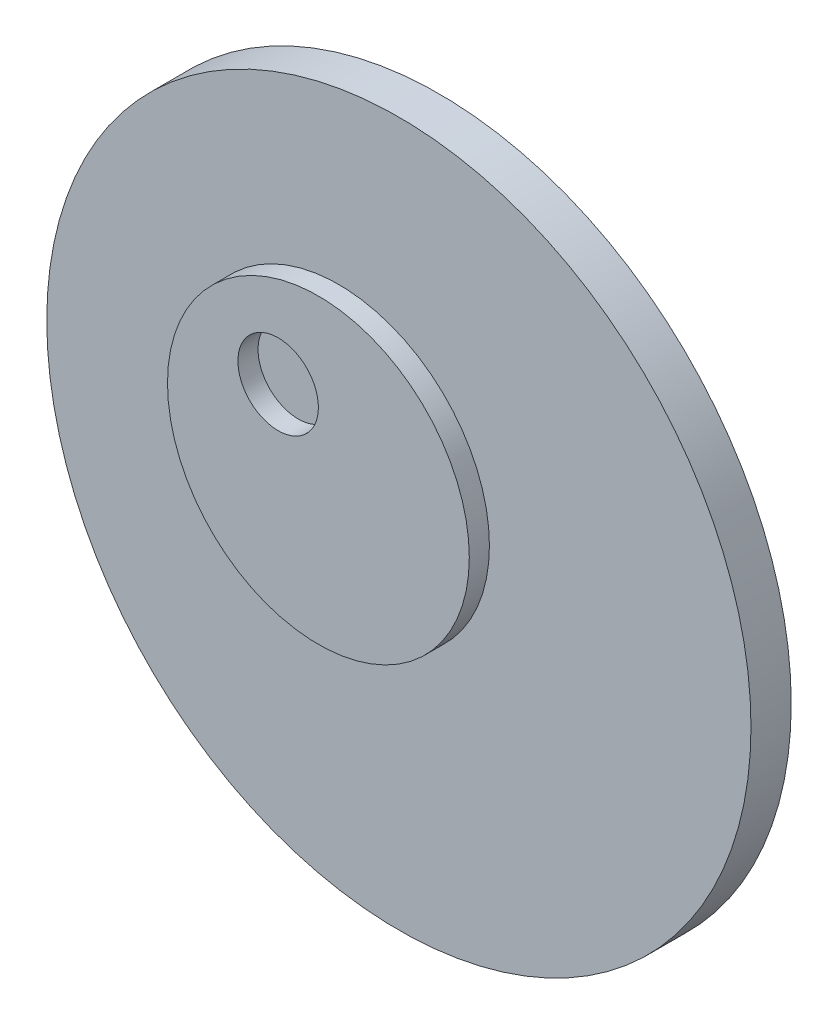
ISO-10303-21;
HEADER;
FILE_DESCRIPTION(('STEP AP214'),'2;1');
FILE_NAME('part.step','',(''),(''),'','','');
FILE_SCHEMA(('AUTOMOTIVE_DESIGN { 1 0 10303 214 1 1 1 1 }'));
ENDSEC;
DATA;
#1=APPLICATION_CONTEXT('core data for automotive mechanical design processes');
#2=APPLICATION_PROTOCOL_DEFINITION('international standard','automotive_design',2000,#1);
#3=PRODUCT_CONTEXT('',#1,'mechanical');
#4=PRODUCT('Part','Part','',(#3));
#5=PRODUCT_RELATED_PRODUCT_CATEGORY('part','',(#4));
#6=PRODUCT_DEFINITION_FORMATION('','',#4);
#7=PRODUCT_DEFINITION_CONTEXT('part definition',#1,'design');
#8=PRODUCT_DEFINITION('design','',#6,#7);
#9=PRODUCT_DEFINITION_SHAPE('','',#8);
#10=(LENGTH_UNIT() NAMED_UNIT(*) SI_UNIT(.MILLI.,.METRE.));
#11=(NAMED_UNIT(*) PLANE_ANGLE_UNIT() SI_UNIT($,.RADIAN.));
#12=(NAMED_UNIT(*) SI_UNIT($,.STERADIAN.) SOLID_ANGLE_UNIT());
#13=UNCERTAINTY_MEASURE_WITH_UNIT(LENGTH_MEASURE(1.E-05),#10,'distance_accuracy_value','');
#14=(GEOMETRIC_REPRESENTATION_CONTEXT(3) GLOBAL_UNCERTAINTY_ASSIGNED_CONTEXT((#13)) GLOBAL_UNIT_ASSIGNED_CONTEXT((#10,
#11,#12)) REPRESENTATION_CONTEXT('',''));
#15=CARTESIAN_POINT('',(0.,0.,0.));
#16=DIRECTION('',(0.,0.,1.));
#17=DIRECTION('',(1.,0.,0.));
#18=AXIS2_PLACEMENT_3D('',#15,#16,#17);
#19=CARTESIAN_POINT('',(-5.,4.,3.));
#20=DIRECTION('',(0.,0.,-1.));
#21=DIRECTION('',(-1.,0.,0.));
#22=AXIS2_PLACEMENT_3D('',#19,#20,#21);
#23=CYLINDRICAL_SURFACE('',#22,2.);
#24=CARTESIAN_POINT('',(-5.,4.,3.));
#25=DIRECTION('',(0.,0.,1.));
#26=DIRECTION('',(1.,0.,0.));
#27=AXIS2_PLACEMENT_3D('',#24,#25,#26);
#28=CIRCLE('',#27,2.);
#29=CARTESIAN_POINT('',(-3.,4.,3.));
#30=VERTEX_POINT('',#29);
#31=EDGE_CURVE('E58',#30,#30,#28,.T.);
#32=ORIENTED_EDGE('',*,*,#31,.T.);
#33=EDGE_LOOP('',(#32));
#34=FACE_BOUND('',#33,.T.);
#35=CARTESIAN_POINT('',(-5.,4.,2.));
#36=DIRECTION('',(0.,0.,1.));
#37=DIRECTION('',(1.,0.,0.));
#38=AXIS2_PLACEMENT_3D('',#35,#36,#37);
#39=CIRCLE('',#38,2.);
#40=CARTESIAN_POINT('',(-3.,4.,2.));
#41=VERTEX_POINT('',#40);
#42=EDGE_CURVE('E64',#41,#41,#39,.T.);
#43=ORIENTED_EDGE('',*,*,#42,.F.);
#44=EDGE_LOOP('',(#43));
#45=FACE_BOUND('',#44,.T.);
#46=ADVANCED_FACE('F51',(#34,#45),#23,.F.);
#47=CARTESIAN_POINT('',(-3.,1.3,3.));
#48=DIRECTION('',(0.,0.,-1.));
#49=DIRECTION('',(-1.,0.,0.));
#50=AXIS2_PLACEMENT_3D('',#47,#48,#49);
#51=CYLINDRICAL_SURFACE('',#50,7.5);
#52=CARTESIAN_POINT('',(-3.,1.3,3.));
#53=DIRECTION('',(0.,0.,1.));
#54=DIRECTION('',(1.,0.,0.));
#55=AXIS2_PLACEMENT_3D('',#52,#53,#54);
#56=CIRCLE('',#55,7.5);
#57=CARTESIAN_POINT('',(4.5,1.3,3.));
#58=VERTEX_POINT('',#57);
#59=EDGE_CURVE('E11',#58,#58,#56,.T.);
#60=ORIENTED_EDGE('',*,*,#59,.F.);
#61=EDGE_LOOP('',(#60));
#62=FACE_BOUND('',#61,.T.);
#63=CARTESIAN_POINT('',(-3.,1.3,2.));
#64=DIRECTION('',(0.,0.,1.));
#65=DIRECTION('',(1.,0.,0.));
#66=AXIS2_PLACEMENT_3D('',#63,#64,#65);
#67=CIRCLE('',#66,7.5);
#68=CARTESIAN_POINT('',(4.5,1.3,2.));
#69=VERTEX_POINT('',#68);
#70=EDGE_CURVE('E54',#69,#69,#67,.T.);
#71=ORIENTED_EDGE('',*,*,#70,.T.);
#72=EDGE_LOOP('',(#71));
#73=FACE_BOUND('',#72,.T.);
#74=ADVANCED_FACE('F71',(#62,#73),#51,.T.);
#75=CARTESIAN_POINT('',(0.,0.,3.));
#76=DIRECTION('',(0.,0.,1.));
#77=DIRECTION('',(1.,0.,0.));
#78=AXIS2_PLACEMENT_3D('',#75,#76,#77);
#79=PLANE('',#78);
#80=ORIENTED_EDGE('',*,*,#31,.F.);
#81=EDGE_LOOP('',(#80));
#82=FACE_BOUND('',#81,.T.);
#83=ORIENTED_EDGE('',*,*,#59,.T.);
#84=EDGE_LOOP('',(#83));
#85=FACE_BOUND('',#84,.T.);
#86=ADVANCED_FACE('F75',(#82,#85),#79,.T.);
#87=CARTESIAN_POINT('',(0.,0.,2.));
#88=DIRECTION('',(0.,0.,1.));
#89=DIRECTION('',(1.,0.,0.));
#90=AXIS2_PLACEMENT_3D('',#87,#88,#89);
#91=PLANE('',#90);
#92=ORIENTED_EDGE('',*,*,#42,.T.);
#93=EDGE_LOOP('',(#92));
#94=FACE_BOUND('',#93,.T.);
#95=ORIENTED_EDGE('',*,*,#70,.F.);
#96=EDGE_LOOP('',(#95));
#97=FACE_BOUND('',#96,.T.);
#98=ADVANCED_FACE('F73',(#94,#97),#91,.F.);
#99=CLOSED_SHELL('',(#46,#74,#86,#98));
#100=MANIFOLD_SOLID_BREP('B2',#99);
#101=CARTESIAN_POINT('',(0.,0.,2.));
#102=DIRECTION('',(0.,0.,-1.));
#103=DIRECTION('',(-1.,0.,0.));
#104=AXIS2_PLACEMENT_3D('',#101,#102,#103);
#105=CYLINDRICAL_SURFACE('',#104,17.5);
#106=CARTESIAN_POINT('',(0.,0.,2.));
#107=DIRECTION('',(0.,0.,1.));
#108=DIRECTION('',(1.,0.,0.));
#109=AXIS2_PLACEMENT_3D('',#106,#107,#108);
#110=CIRCLE('',#109,17.5);
#111=CARTESIAN_POINT('',(17.5,0.,2.));
#112=VERTEX_POINT('',#111);
#113=EDGE_CURVE('E50',#112,#112,#110,.T.);
#114=ORIENTED_EDGE('',*,*,#113,.F.);
#115=EDGE_LOOP('',(#114));
#116=FACE_BOUND('',#115,.T.);
#117=CARTESIAN_POINT('',(0.,0.,0.));
#118=DIRECTION('',(0.,0.,1.));
#119=DIRECTION('',(1.,0.,0.));
#120=AXIS2_PLACEMENT_3D('',#117,#118,#119);
#121=CIRCLE('',#120,17.5);
#122=CARTESIAN_POINT('',(17.5,0.,0.));
#123=VERTEX_POINT('',#122);
#124=EDGE_CURVE('E116',#123,#123,#121,.T.);
#125=ORIENTED_EDGE('',*,*,#124,.T.);
#126=EDGE_LOOP('',(#125));
#127=FACE_BOUND('',#126,.T.);
#128=ADVANCED_FACE('F113',(#116,#127),#105,.T.);
#129=CARTESIAN_POINT('',(0.,0.,2.));
#130=DIRECTION('',(0.,0.,1.));
#131=DIRECTION('',(1.,0.,0.));
#132=AXIS2_PLACEMENT_3D('',#129,#130,#131);
#133=PLANE('',#132);
#134=ORIENTED_EDGE('',*,*,#113,.T.);
#135=EDGE_LOOP('',(#134));
#136=FACE_BOUND('',#135,.T.);
#137=ADVANCED_FACE('F128',(#136),#133,.T.);
#138=CARTESIAN_POINT('',(0.,0.,0.));
#139=DIRECTION('',(0.,0.,1.));
#140=DIRECTION('',(1.,0.,0.));
#141=AXIS2_PLACEMENT_3D('',#138,#139,#140);
#142=PLANE('',#141);
#143=ORIENTED_EDGE('',*,*,#124,.F.);
#144=EDGE_LOOP('',(#143));
#145=FACE_BOUND('',#144,.T.);
#146=ADVANCED_FACE('F126',(#145),#142,.F.);
#147=CLOSED_SHELL('',(#128,#137,#146));
#148=MANIFOLD_SOLID_BREP('B6',#147);
#149=ADVANCED_BREP_SHAPE_REPRESENTATION('',(#18,#100,#148),#14);
#150=SHAPE_DEFINITION_REPRESENTATION(#9,#149);
ENDSEC;
END-ISO-10303-21;
